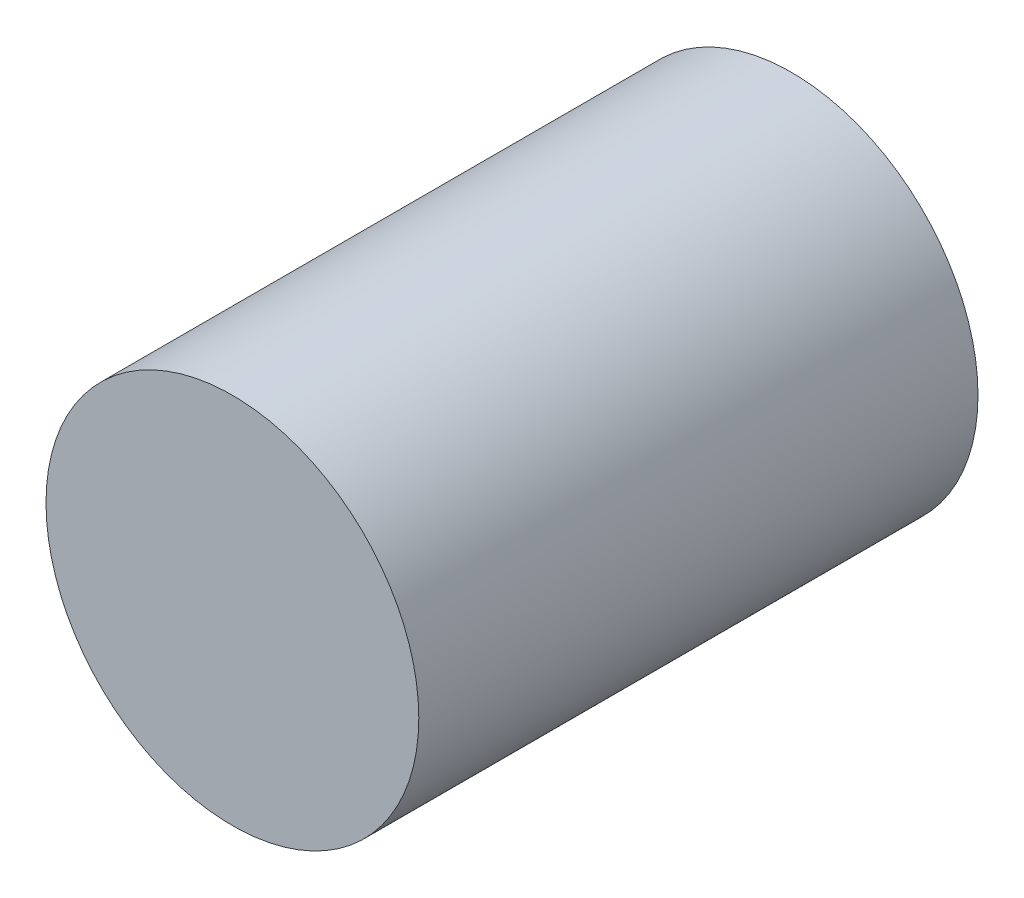
ISO-10303-21;
HEADER;
FILE_DESCRIPTION(('STEP AP214'),'2;1');
FILE_NAME('part.step','',(''),(''),'','','');
FILE_SCHEMA(('AUTOMOTIVE_DESIGN { 1 0 10303 214 1 1 1 1 }'));
ENDSEC;
DATA;
#1=APPLICATION_CONTEXT('core data for automotive mechanical design processes');
#2=APPLICATION_PROTOCOL_DEFINITION('international standard','automotive_design',2000,#1);
#3=PRODUCT_CONTEXT('',#1,'mechanical');
#4=PRODUCT('Part','Part','',(#3));
#5=PRODUCT_RELATED_PRODUCT_CATEGORY('part','',(#4));
#6=PRODUCT_DEFINITION_FORMATION('','',#4);
#7=PRODUCT_DEFINITION_CONTEXT('part definition',#1,'design');
#8=PRODUCT_DEFINITION('design','',#6,#7);
#9=PRODUCT_DEFINITION_SHAPE('','',#8);
#10=(LENGTH_UNIT() NAMED_UNIT(*) SI_UNIT(.MILLI.,.METRE.));
#11=(NAMED_UNIT(*) PLANE_ANGLE_UNIT() SI_UNIT($,.RADIAN.));
#12=(NAMED_UNIT(*) SI_UNIT($,.STERADIAN.) SOLID_ANGLE_UNIT());
#13=UNCERTAINTY_MEASURE_WITH_UNIT(LENGTH_MEASURE(1.E-05),#10,'distance_accuracy_value','');
#14=(GEOMETRIC_REPRESENTATION_CONTEXT(3) GLOBAL_UNCERTAINTY_ASSIGNED_CONTEXT((#13)) GLOBAL_UNIT_ASSIGNED_CONTEXT((#10,
#11,#12)) REPRESENTATION_CONTEXT('',''));
#15=CARTESIAN_POINT('',(0.,0.,0.));
#16=DIRECTION('',(0.,0.,1.));
#17=DIRECTION('',(1.,0.,0.));
#18=AXIS2_PLACEMENT_3D('',#15,#16,#17);
#19=CARTESIAN_POINT('',(0.,0.,19.05));
#20=DIRECTION('',(0.,0.,-1.));
#21=DIRECTION('',(-1.,0.,0.));
#22=AXIS2_PLACEMENT_3D('',#19,#20,#21);
#23=CYLINDRICAL_SURFACE('',#22,6.35);
#24=CARTESIAN_POINT('',(0.,0.,19.05));
#25=DIRECTION('',(0.,0.,1.));
#26=DIRECTION('',(1.,0.,0.));
#27=AXIS2_PLACEMENT_3D('',#24,#25,#26);
#28=CIRCLE('',#27,6.35);
#29=CARTESIAN_POINT('',(-6.35,0.,19.05));
#30=VERTEX_POINT('',#29);
#31=EDGE_CURVE('E10',#30,#30,#28,.T.);
#32=CARTESIAN_POINT('',(0.,0.,0.));
#33=DIRECTION('',(0.,0.,1.));
#34=DIRECTION('',(1.,0.,0.));
#35=AXIS2_PLACEMENT_3D('',#32,#33,#34);
#36=CIRCLE('',#35,6.35);
#37=CARTESIAN_POINT('',(-6.35,0.,0.));
#38=VERTEX_POINT('',#37);
#39=EDGE_CURVE('E40',#38,#38,#36,.T.);
#40=CARTESIAN_POINT('',(-6.35,0.,19.05));
#41=CARTESIAN_POINT('',(-6.35,0.,18.8515625));
#42=CARTESIAN_POINT('',(-6.35,0.,18.653125));
#43=CARTESIAN_POINT('',(-6.35,0.,18.25625));
#44=CARTESIAN_POINT('',(-6.35,0.,18.0578125));
#45=CARTESIAN_POINT('',(-6.35,0.,17.6609375));
#46=CARTESIAN_POINT('',(-6.35,0.,17.4625));
#47=CARTESIAN_POINT('',(-6.35,0.,17.065625));
#48=CARTESIAN_POINT('',(-6.35,0.,16.8671875));
#49=CARTESIAN_POINT('',(-6.35,0.,16.4703125));
#50=CARTESIAN_POINT('',(-6.35,0.,16.271875));
#51=CARTESIAN_POINT('',(-6.35,0.,15.875));
#52=CARTESIAN_POINT('',(-6.35,0.,15.6765625));
#53=CARTESIAN_POINT('',(-6.35,0.,15.2796875));
#54=CARTESIAN_POINT('',(-6.35,0.,15.08125));
#55=CARTESIAN_POINT('',(-6.35,0.,14.684375));
#56=CARTESIAN_POINT('',(-6.35,0.,14.4859375));
#57=CARTESIAN_POINT('',(-6.35,0.,14.0890625));
#58=CARTESIAN_POINT('',(-6.35,0.,13.890625));
#59=CARTESIAN_POINT('',(-6.35,0.,13.49375));
#60=CARTESIAN_POINT('',(-6.35,0.,13.2953125));
#61=CARTESIAN_POINT('',(-6.35,0.,12.8984375));
#62=CARTESIAN_POINT('',(-6.35,0.,12.7));
#63=CARTESIAN_POINT('',(-6.35,0.,12.303125));
#64=CARTESIAN_POINT('',(-6.35,0.,12.1046875));
#65=CARTESIAN_POINT('',(-6.35,0.,11.7078125));
#66=CARTESIAN_POINT('',(-6.35,0.,11.509375));
#67=CARTESIAN_POINT('',(-6.35,0.,11.1125));
#68=CARTESIAN_POINT('',(-6.35,0.,10.9140625));
#69=CARTESIAN_POINT('',(-6.35,0.,10.5171875));
#70=CARTESIAN_POINT('',(-6.35,0.,10.31875));
#71=CARTESIAN_POINT('',(-6.35,0.,9.921875));
#72=CARTESIAN_POINT('',(-6.35,0.,9.7234375));
#73=CARTESIAN_POINT('',(-6.35,0.,9.3265625));
#74=CARTESIAN_POINT('',(-6.35,0.,9.128125));
#75=CARTESIAN_POINT('',(-6.35,0.,8.73125));
#76=CARTESIAN_POINT('',(-6.35,0.,8.5328125));
#77=CARTESIAN_POINT('',(-6.35,0.,8.1359375));
#78=CARTESIAN_POINT('',(-6.35,0.,7.9375));
#79=CARTESIAN_POINT('',(-6.35,0.,7.540625));
#80=CARTESIAN_POINT('',(-6.35,0.,7.3421875));
#81=CARTESIAN_POINT('',(-6.35,0.,6.9453125));
#82=CARTESIAN_POINT('',(-6.35,0.,6.746875));
#83=CARTESIAN_POINT('',(-6.35,0.,6.35));
#84=CARTESIAN_POINT('',(-6.35,0.,6.1515625));
#85=CARTESIAN_POINT('',(-6.35,0.,5.7546875));
#86=CARTESIAN_POINT('',(-6.35,0.,5.55625));
#87=CARTESIAN_POINT('',(-6.35,0.,5.159375));
#88=CARTESIAN_POINT('',(-6.35,0.,4.9609375));
#89=CARTESIAN_POINT('',(-6.35,0.,4.5640625));
#90=CARTESIAN_POINT('',(-6.35,0.,4.365625));
#91=CARTESIAN_POINT('',(-6.35,0.,3.96875));
#92=CARTESIAN_POINT('',(-6.35,0.,3.7703125));
#93=CARTESIAN_POINT('',(-6.35,0.,3.3734375));
#94=CARTESIAN_POINT('',(-6.35,0.,3.175));
#95=CARTESIAN_POINT('',(-6.35,0.,2.778125));
#96=CARTESIAN_POINT('',(-6.35,0.,2.5796875));
#97=CARTESIAN_POINT('',(-6.35,0.,2.1828125));
#98=CARTESIAN_POINT('',(-6.35,0.,1.984375));
#99=CARTESIAN_POINT('',(-6.35,0.,1.5875));
#100=CARTESIAN_POINT('',(-6.35,0.,1.3890625));
#101=CARTESIAN_POINT('',(-6.35,0.,0.992187500000001));
#102=CARTESIAN_POINT('',(-6.35,0.,0.793750000000001));
#103=CARTESIAN_POINT('',(-6.35,0.,0.396875));
#104=CARTESIAN_POINT('',(-6.35,0.,0.1984375));
#105=CARTESIAN_POINT('',(-6.35,0.,0.));
#106=B_SPLINE_CURVE_WITH_KNOTS('',3,(#40,#41,#42,#43,#44,#45,#46,#47,#48,#49,#50,#51,#52,#53,
#54,#55,#56,#57,#58,#59,#60,#61,#62,#63,#64,#65,#66,#67,#68,#69,#70,#71,#72,#73,#74,#75,#76,#77,
#78,#79,#80,#81,#82,#83,#84,#85,#86,#87,#88,#89,#90,#91,#92,#93,#94,#95,#96,#97,#98,#99,#100,
#101,#102,#103,#104,#105),.UNSPECIFIED.,.F.,.F.,(4,2,2,2,2,2,2,2,2,2,2,2,2,2,2,2,2,2,2,2,2,2,2,
2,2,2,2,2,2,2,2,2,4),(0.,0.5953125,1.190625,1.7859375,2.38125,2.9765625,3.571875,4.1671875,
4.7625,5.3578125,5.953125,6.5484375,7.14375,7.7390625,8.334375,8.9296875,9.525,10.1203125,
10.715625,11.3109375,11.90625,12.5015625,13.096875,13.6921875,14.2875,14.8828125,15.478125,
16.0734375,16.66875,17.2640625,17.859375,18.4546875,19.05),.UNSPECIFIED.);
#107=EDGE_CURVE('BSEAM37',#30,#38,#106,.T.);
#108=ORIENTED_EDGE('',*,*,#31,.F.);
#109=ORIENTED_EDGE('',*,*,#39,.T.);
#110=ORIENTED_EDGE('',*,*,#107,.T.);
#111=ORIENTED_EDGE('',*,*,#107,.F.);
#112=EDGE_LOOP('',(#108,#110,#109,#111));
#113=FACE_BOUND('',#112,.T.);
#114=ADVANCED_FACE('F37',(#113),#23,.T.);
#115=CARTESIAN_POINT('',(0.,0.,19.05));
#116=DIRECTION('',(0.,0.,1.));
#117=DIRECTION('',(1.,0.,0.));
#118=AXIS2_PLACEMENT_3D('',#115,#116,#117);
#119=PLANE('',#118);
#120=ORIENTED_EDGE('',*,*,#31,.T.);
#121=EDGE_LOOP('',(#120));
#122=FACE_BOUND('',#121,.T.);
#123=ADVANCED_FACE('F54',(#122),#119,.T.);
#124=CARTESIAN_POINT('',(0.,0.,0.));
#125=DIRECTION('',(0.,0.,1.));
#126=DIRECTION('',(1.,0.,0.));
#127=AXIS2_PLACEMENT_3D('',#124,#125,#126);
#128=PLANE('',#127);
#129=ORIENTED_EDGE('',*,*,#39,.F.);
#130=EDGE_LOOP('',(#129));
#131=FACE_BOUND('',#130,.T.);
#132=ADVANCED_FACE('F52',(#131),#128,.F.);
#133=CLOSED_SHELL('',(#114,#123,#132));
#134=MANIFOLD_SOLID_BREP('B2',#133);
#135=ADVANCED_BREP_SHAPE_REPRESENTATION('',(#18,#134),#14);
#136=SHAPE_DEFINITION_REPRESENTATION(#9,#135);
ENDSEC;
END-ISO-10303-21;
